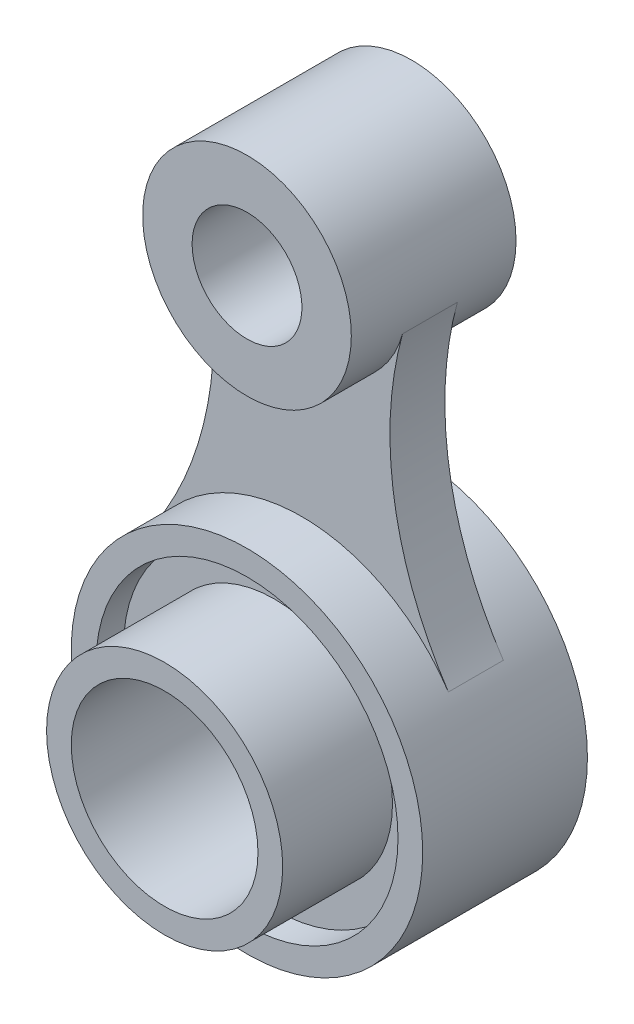
ISO-10303-21;
HEADER;
FILE_DESCRIPTION(('STEP AP214'),'2;1');
FILE_NAME('part.step','',(''),(''),'','','');
FILE_SCHEMA(('AUTOMOTIVE_DESIGN { 1 0 10303 214 1 1 1 1 }'));
ENDSEC;
DATA;
#1=APPLICATION_CONTEXT('core data for automotive mechanical design processes');
#2=APPLICATION_PROTOCOL_DEFINITION('international standard','automotive_design',2000,#1);
#3=PRODUCT_CONTEXT('',#1,'mechanical');
#4=PRODUCT('Part','Part','',(#3));
#5=PRODUCT_RELATED_PRODUCT_CATEGORY('part','',(#4));
#6=PRODUCT_DEFINITION_FORMATION('','',#4);
#7=PRODUCT_DEFINITION_CONTEXT('part definition',#1,'design');
#8=PRODUCT_DEFINITION('design','',#6,#7);
#9=PRODUCT_DEFINITION_SHAPE('','',#8);
#10=(LENGTH_UNIT() NAMED_UNIT(*) SI_UNIT(.MILLI.,.METRE.));
#11=(NAMED_UNIT(*) PLANE_ANGLE_UNIT() SI_UNIT($,.RADIAN.));
#12=(NAMED_UNIT(*) SI_UNIT($,.STERADIAN.) SOLID_ANGLE_UNIT());
#13=UNCERTAINTY_MEASURE_WITH_UNIT(LENGTH_MEASURE(1.E-05),#10,'distance_accuracy_value','');
#14=(GEOMETRIC_REPRESENTATION_CONTEXT(3) GLOBAL_UNCERTAINTY_ASSIGNED_CONTEXT((#13)) GLOBAL_UNIT_ASSIGNED_CONTEXT((#10,
#11,#12)) REPRESENTATION_CONTEXT('',''));
#15=CARTESIAN_POINT('',(0.,0.,0.));
#16=DIRECTION('',(0.,0.,1.));
#17=DIRECTION('',(1.,0.,0.));
#18=AXIS2_PLACEMENT_3D('',#15,#16,#17);
#19=CARTESIAN_POINT('',(0.,37.5,30.));
#20=DIRECTION('',(0.,0.,-1.));
#21=DIRECTION('',(-1.,0.,0.));
#22=AXIS2_PLACEMENT_3D('',#19,#20,#21);
#23=CYLINDRICAL_SURFACE('',#22,19.);
#24=CARTESIAN_POINT('',(0.,37.5,0.));
#25=DIRECTION('',(0.,0.,1.));
#26=DIRECTION('',(1.,0.,0.));
#27=AXIS2_PLACEMENT_3D('',#24,#25,#26);
#28=CIRCLE('',#27,19.);
#29=CARTESIAN_POINT('',(19.,37.5,0.));
#30=VERTEX_POINT('',#29);
#31=EDGE_CURVE('E37',#30,#30,#28,.T.);
#32=ORIENTED_EDGE('',*,*,#31,.T.);
#33=EDGE_LOOP('',(#32));
#34=FACE_BOUND('',#33,.T.);
#35=CARTESIAN_POINT('',(0.,37.5,30.));
#36=DIRECTION('',(0.,0.,1.));
#37=DIRECTION('',(1.,0.,0.));
#38=AXIS2_PLACEMENT_3D('',#35,#36,#37);
#39=CIRCLE('',#38,19.);
#40=CARTESIAN_POINT('',(19.,37.5,30.));
#41=VERTEX_POINT('',#40);
#42=EDGE_CURVE('E11',#41,#41,#39,.T.);
#43=ORIENTED_EDGE('',*,*,#42,.F.);
#44=EDGE_LOOP('',(#43));
#45=FACE_BOUND('',#44,.T.);
#46=CARTESIAN_POINT('',(0.,37.5,20.));
#47=DIRECTION('',(0.,0.,-1.));
#48=DIRECTION('',(1.,0.,0.));
#49=AXIS2_PLACEMENT_3D('',#46,#47,#48);
#50=CIRCLE('',#49,19.);
#51=CARTESIAN_POINT('',(18.3212439861572,32.4669076305221,20.));
#52=VERTEX_POINT('',#51);
#53=CARTESIAN_POINT('',(-18.3212439861572,32.4669076305221,20.));
#54=VERTEX_POINT('',#53);
#55=EDGE_CURVE('E57',#52,#54,#50,.T.);
#56=ORIENTED_EDGE('',*,*,#55,.F.);
#57=DIRECTION('',(0.,0.,-1.));
#58=VECTOR('',#57,1.);
#59=CARTESIAN_POINT('',(18.3212439861572,32.4669076305221,20.));
#60=LINE('',#59,#58);
#61=CARTESIAN_POINT('',(18.3212439861572,32.4669076305221,10.));
#62=VERTEX_POINT('',#61);
#63=EDGE_CURVE('E93',#52,#62,#60,.T.);
#64=ORIENTED_EDGE('',*,*,#63,.T.);
#65=CARTESIAN_POINT('',(0.,37.5,10.));
#66=DIRECTION('',(0.,0.,-1.));
#67=DIRECTION('',(1.,0.,0.));
#68=AXIS2_PLACEMENT_3D('',#65,#66,#67);
#69=CIRCLE('',#68,19.);
#70=CARTESIAN_POINT('',(-18.3212439861572,32.4669076305221,10.));
#71=VERTEX_POINT('',#70);
#72=EDGE_CURVE('E82',#62,#71,#69,.T.);
#73=ORIENTED_EDGE('',*,*,#72,.T.);
#74=DIRECTION('',(0.,0.,-1.));
#75=VECTOR('',#74,1.);
#76=CARTESIAN_POINT('',(-18.3212439861572,32.4669076305221,20.));
#77=LINE('',#76,#75);
#78=EDGE_CURVE('E103',#54,#71,#77,.T.);
#79=ORIENTED_EDGE('',*,*,#78,.F.);
#80=EDGE_LOOP('',(#56,#64,#73,#79));
#81=FACE_BOUND('',#80,.T.);
#82=ADVANCED_FACE('F34',(#34,#45,#81),#23,.T.);
#83=CARTESIAN_POINT('',(0.,37.5,30.));
#84=DIRECTION('',(0.,0.,1.));
#85=DIRECTION('',(1.,0.,0.));
#86=AXIS2_PLACEMENT_3D('',#83,#84,#85);
#87=PLANE('',#86);
#88=CARTESIAN_POINT('',(0.,37.5,30.));
#89=DIRECTION('',(0.,0.,1.));
#90=DIRECTION('',(1.,0.,0.));
#91=AXIS2_PLACEMENT_3D('',#88,#89,#90);
#92=CIRCLE('',#91,10.);
#93=CARTESIAN_POINT('',(-10.,37.5,30.));
#94=VERTEX_POINT('',#93);
#95=EDGE_CURVE('E290',#94,#94,#92,.F.);
#96=ORIENTED_EDGE('',*,*,#95,.T.);
#97=EDGE_LOOP('',(#96));
#98=FACE_BOUND('',#97,.T.);
#99=ORIENTED_EDGE('',*,*,#42,.T.);
#100=EDGE_LOOP('',(#99));
#101=FACE_BOUND('',#100,.T.);
#102=ADVANCED_FACE('F114',(#98,#101),#87,.T.);
#103=CARTESIAN_POINT('',(0.,37.5,0.));
#104=DIRECTION('',(0.,0.,1.));
#105=DIRECTION('',(1.,0.,0.));
#106=AXIS2_PLACEMENT_3D('',#103,#104,#105);
#107=PLANE('',#106);
#108=CARTESIAN_POINT('',(0.,37.5,0.));
#109=DIRECTION('',(0.,0.,1.));
#110=DIRECTION('',(1.,0.,0.));
#111=AXIS2_PLACEMENT_3D('',#108,#109,#110);
#112=CIRCLE('',#111,10.);
#113=CARTESIAN_POINT('',(-10.,37.5,0.));
#114=VERTEX_POINT('',#113);
#115=EDGE_CURVE('E295',#114,#114,#112,.T.);
#116=ORIENTED_EDGE('',*,*,#115,.T.);
#117=EDGE_LOOP('',(#116));
#118=FACE_BOUND('',#117,.T.);
#119=ORIENTED_EDGE('',*,*,#31,.F.);
#120=EDGE_LOOP('',(#119));
#121=FACE_BOUND('',#120,.T.);
#122=ADVANCED_FACE('F111',(#118,#121),#107,.F.);
#123=CARTESIAN_POINT('',(-80.034907939529,15.5133333333333,20.));
#124=DIRECTION('',(0.,0.,-1.));
#125=DIRECTION('',(-1.,0.,0.));
#126=AXIS2_PLACEMENT_3D('',#123,#124,#125);
#127=CYLINDRICAL_SURFACE('',#126,64.);
#128=CARTESIAN_POINT('',(-80.034907939529,15.5133333333333,10.));
#129=DIRECTION('',(0.,0.,-1.));
#130=DIRECTION('',(-1.,0.,0.));
#131=AXIS2_PLACEMENT_3D('',#128,#129,#130);
#132=CIRCLE('',#131,64.);
#133=CARTESIAN_POINT('',(-26.6783026465097,-19.8288888888889,10.));
#134=VERTEX_POINT('',#133);
#135=EDGE_CURVE('E48',#71,#134,#132,.T.);
#136=ORIENTED_EDGE('',*,*,#135,.T.);
#137=DIRECTION('',(0.,0.,-1.));
#138=VECTOR('',#137,1.);
#139=CARTESIAN_POINT('',(-26.6783026465097,-19.8288888888889,20.));
#140=LINE('',#139,#138);
#141=CARTESIAN_POINT('',(-26.6783026465097,-19.8288888888889,20.));
#142=VERTEX_POINT('',#141);
#143=EDGE_CURVE('E92',#142,#134,#140,.T.);
#144=ORIENTED_EDGE('',*,*,#143,.F.);
#145=CARTESIAN_POINT('',(-80.034907939529,15.5133333333333,20.));
#146=DIRECTION('',(0.,0.,-1.));
#147=DIRECTION('',(-1.,0.,0.));
#148=AXIS2_PLACEMENT_3D('',#145,#146,#147);
#149=CIRCLE('',#148,64.);
#150=EDGE_CURVE('E75',#54,#142,#149,.T.);
#151=ORIENTED_EDGE('',*,*,#150,.F.);
#152=ORIENTED_EDGE('',*,*,#78,.T.);
#153=EDGE_LOOP('',(#136,#144,#151,#152));
#154=FACE_BOUND('',#153,.T.);
#155=ADVANCED_FACE('F113',(#154),#127,.F.);
#156=CARTESIAN_POINT('',(80.034907939529,15.5133333333333,20.));
#157=DIRECTION('',(0.,0.,-1.));
#158=DIRECTION('',(-1.,0.,0.));
#159=AXIS2_PLACEMENT_3D('',#156,#157,#158);
#160=CYLINDRICAL_SURFACE('',#159,64.);
#161=CARTESIAN_POINT('',(80.034907939529,15.5133333333333,10.));
#162=DIRECTION('',(0.,0.,-1.));
#163=DIRECTION('',(1.,0.,0.));
#164=AXIS2_PLACEMENT_3D('',#161,#162,#163);
#165=CIRCLE('',#164,64.);
#166=CARTESIAN_POINT('',(26.6783026465097,-19.8288888888889,10.));
#167=VERTEX_POINT('',#166);
#168=EDGE_CURVE('E72',#167,#62,#165,.T.);
#169=ORIENTED_EDGE('',*,*,#168,.T.);
#170=ORIENTED_EDGE('',*,*,#63,.F.);
#171=CARTESIAN_POINT('',(80.034907939529,15.5133333333333,20.));
#172=DIRECTION('',(0.,0.,-1.));
#173=DIRECTION('',(1.,0.,0.));
#174=AXIS2_PLACEMENT_3D('',#171,#172,#173);
#175=CIRCLE('',#174,64.);
#176=CARTESIAN_POINT('',(26.6783026465097,-19.8288888888889,20.));
#177=VERTEX_POINT('',#176);
#178=EDGE_CURVE('E89',#177,#52,#175,.T.);
#179=ORIENTED_EDGE('',*,*,#178,.F.);
#180=DIRECTION('',(0.,0.,-1.));
#181=VECTOR('',#180,1.);
#182=CARTESIAN_POINT('',(26.6783026465097,-19.8288888888889,20.));
#183=LINE('',#182,#181);
#184=EDGE_CURVE('E87',#177,#167,#183,.T.);
#185=ORIENTED_EDGE('',*,*,#184,.T.);
#186=EDGE_LOOP('',(#169,#170,#179,#185));
#187=FACE_BOUND('',#186,.T.);
#188=ADVANCED_FACE('F88',(#187),#160,.F.);
#189=CARTESIAN_POINT('',(-40.0174539697645,-10.9933333333333,20.));
#190=DIRECTION('',(0.,0.,-1.));
#191=DIRECTION('',(-1.,0.,0.));
#192=AXIS2_PLACEMENT_3D('',#189,#190,#191);
#193=PLANE('',#192);
#194=ORIENTED_EDGE('',*,*,#150,.T.);
#195=CARTESIAN_POINT('',(0.,-37.5,20.));
#196=DIRECTION('',(0.,0.,-1.));
#197=DIRECTION('',(1.,0.,0.));
#198=AXIS2_PLACEMENT_3D('',#195,#196,#197);
#199=CIRCLE('',#198,32.);
#200=EDGE_CURVE('E280',#142,#177,#199,.T.);
#201=ORIENTED_EDGE('',*,*,#200,.T.);
#202=ORIENTED_EDGE('',*,*,#178,.T.);
#203=ORIENTED_EDGE('',*,*,#55,.T.);
#204=EDGE_LOOP('',(#194,#201,#202,#203));
#205=FACE_BOUND('',#204,.T.);
#206=ADVANCED_FACE('F209',(#205),#193,.F.);
#207=CARTESIAN_POINT('',(-40.0174539697645,-10.9933333333333,10.));
#208=DIRECTION('',(0.,0.,-1.));
#209=DIRECTION('',(-1.,0.,0.));
#210=AXIS2_PLACEMENT_3D('',#207,#208,#209);
#211=PLANE('',#210);
#212=ORIENTED_EDGE('',*,*,#135,.F.);
#213=ORIENTED_EDGE('',*,*,#72,.F.);
#214=ORIENTED_EDGE('',*,*,#168,.F.);
#215=CARTESIAN_POINT('',(0.,-37.5,10.));
#216=DIRECTION('',(0.,0.,-1.));
#217=DIRECTION('',(1.,0.,0.));
#218=AXIS2_PLACEMENT_3D('',#215,#216,#217);
#219=CIRCLE('',#218,32.);
#220=EDGE_CURVE('E80',#134,#167,#219,.T.);
#221=ORIENTED_EDGE('',*,*,#220,.F.);
#222=EDGE_LOOP('',(#212,#213,#214,#221));
#223=FACE_BOUND('',#222,.T.);
#224=ADVANCED_FACE('F78',(#223),#211,.T.);
#225=CARTESIAN_POINT('',(0.,-37.5,30.));
#226=DIRECTION('',(0.,0.,-1.));
#227=DIRECTION('',(-1.,0.,0.));
#228=AXIS2_PLACEMENT_3D('',#225,#226,#227);
#229=CYLINDRICAL_SURFACE('',#228,32.);
#230=CARTESIAN_POINT('',(0.,-37.5,30.));
#231=DIRECTION('',(0.,0.,1.));
#232=DIRECTION('',(1.,0.,0.));
#233=AXIS2_PLACEMENT_3D('',#230,#231,#232);
#234=CIRCLE('',#233,32.);
#235=CARTESIAN_POINT('',(32.,-37.5,30.));
#236=VERTEX_POINT('',#235);
#237=EDGE_CURVE('E98',#236,#236,#234,.T.);
#238=ORIENTED_EDGE('',*,*,#237,.F.);
#239=EDGE_LOOP('',(#238));
#240=FACE_BOUND('',#239,.T.);
#241=CARTESIAN_POINT('',(0.,-37.5,0.));
#242=DIRECTION('',(0.,0.,1.));
#243=DIRECTION('',(1.,0.,0.));
#244=AXIS2_PLACEMENT_3D('',#241,#242,#243);
#245=CIRCLE('',#244,32.);
#246=CARTESIAN_POINT('',(32.,-37.5,0.));
#247=VERTEX_POINT('',#246);
#248=EDGE_CURVE('E269',#247,#247,#245,.T.);
#249=ORIENTED_EDGE('',*,*,#248,.T.);
#250=EDGE_LOOP('',(#249));
#251=FACE_BOUND('',#250,.T.);
#252=ORIENTED_EDGE('',*,*,#184,.F.);
#253=ORIENTED_EDGE('',*,*,#200,.F.);
#254=ORIENTED_EDGE('',*,*,#143,.T.);
#255=ORIENTED_EDGE('',*,*,#220,.T.);
#256=EDGE_LOOP('',(#252,#253,#254,#255));
#257=FACE_BOUND('',#256,.T.);
#258=ADVANCED_FACE('F96',(#240,#251,#257),#229,.T.);
#259=CARTESIAN_POINT('',(0.,-37.5,30.));
#260=DIRECTION('',(0.,0.,1.));
#261=DIRECTION('',(1.,0.,0.));
#262=AXIS2_PLACEMENT_3D('',#259,#260,#261);
#263=PLANE('',#262);
#264=CARTESIAN_POINT('',(0.,-37.5,30.));
#265=DIRECTION('',(0.,0.,1.));
#266=DIRECTION('',(1.,0.,0.));
#267=AXIS2_PLACEMENT_3D('',#264,#265,#266);
#268=CIRCLE('',#267,27.5);
#269=CARTESIAN_POINT('',(27.5,-37.5,30.));
#270=VERTEX_POINT('',#269);
#271=EDGE_CURVE('E271',#270,#270,#268,.T.);
#272=ORIENTED_EDGE('',*,*,#271,.F.);
#273=EDGE_LOOP('',(#272));
#274=FACE_BOUND('',#273,.T.);
#275=ORIENTED_EDGE('',*,*,#237,.T.);
#276=EDGE_LOOP('',(#275));
#277=FACE_BOUND('',#276,.T.);
#278=ADVANCED_FACE('F154',(#274,#277),#263,.T.);
#279=CARTESIAN_POINT('',(0.,-37.5,0.));
#280=DIRECTION('',(0.,0.,1.));
#281=DIRECTION('',(1.,0.,0.));
#282=AXIS2_PLACEMENT_3D('',#279,#280,#281);
#283=PLANE('',#282);
#284=CARTESIAN_POINT('',(0.,-37.5,0.));
#285=DIRECTION('',(0.,0.,1.));
#286=DIRECTION('',(1.,0.,0.));
#287=AXIS2_PLACEMENT_3D('',#284,#285,#286);
#288=CIRCLE('',#287,17.);
#289=CARTESIAN_POINT('',(-17.,-37.5,0.));
#290=VERTEX_POINT('',#289);
#291=EDGE_CURVE('E296',#290,#290,#288,.T.);
#292=ORIENTED_EDGE('',*,*,#291,.T.);
#293=EDGE_LOOP('',(#292));
#294=FACE_BOUND('',#293,.T.);
#295=ORIENTED_EDGE('',*,*,#248,.F.);
#296=EDGE_LOOP('',(#295));
#297=FACE_BOUND('',#296,.T.);
#298=ADVANCED_FACE('F148',(#294,#297),#283,.F.);
#299=CARTESIAN_POINT('',(0.,-37.5,30.));
#300=DIRECTION('',(0.,0.,-1.));
#301=DIRECTION('',(-1.,0.,0.));
#302=AXIS2_PLACEMENT_3D('',#299,#300,#301);
#303=CYLINDRICAL_SURFACE('',#302,27.5);
#304=ORIENTED_EDGE('',*,*,#271,.T.);
#305=EDGE_LOOP('',(#304));
#306=FACE_BOUND('',#305,.T.);
#307=CARTESIAN_POINT('',(0.,-37.5,25.));
#308=DIRECTION('',(0.,0.,1.));
#309=DIRECTION('',(1.,0.,0.));
#310=AXIS2_PLACEMENT_3D('',#307,#308,#309);
#311=CIRCLE('',#310,27.5);
#312=CARTESIAN_POINT('',(27.5,-37.5,25.));
#313=VERTEX_POINT('',#312);
#314=EDGE_CURVE('E275',#313,#313,#311,.T.);
#315=ORIENTED_EDGE('',*,*,#314,.F.);
#316=EDGE_LOOP('',(#315));
#317=FACE_BOUND('',#316,.T.);
#318=ADVANCED_FACE('F153',(#306,#317),#303,.F.);
#319=CARTESIAN_POINT('',(0.,-37.5,25.));
#320=DIRECTION('',(0.,0.,1.));
#321=DIRECTION('',(1.,0.,0.));
#322=AXIS2_PLACEMENT_3D('',#319,#320,#321);
#323=PLANE('',#322);
#324=CARTESIAN_POINT('',(0.,-37.5,25.));
#325=DIRECTION('',(0.,0.,1.));
#326=DIRECTION('',(1.,0.,0.));
#327=AXIS2_PLACEMENT_3D('',#324,#325,#326);
#328=CIRCLE('',#327,21.5);
#329=CARTESIAN_POINT('',(21.5,-37.5,25.));
#330=VERTEX_POINT('',#329);
#331=EDGE_CURVE('E287',#330,#330,#328,.T.);
#332=ORIENTED_EDGE('',*,*,#331,.F.);
#333=EDGE_LOOP('',(#332));
#334=FACE_BOUND('',#333,.T.);
#335=ORIENTED_EDGE('',*,*,#314,.T.);
#336=EDGE_LOOP('',(#335));
#337=FACE_BOUND('',#336,.T.);
#338=ADVANCED_FACE('F197',(#334,#337),#323,.T.);
#339=CARTESIAN_POINT('',(0.,-37.5,45.));
#340=DIRECTION('',(0.,0.,-1.));
#341=DIRECTION('',(-1.,0.,0.));
#342=AXIS2_PLACEMENT_3D('',#339,#340,#341);
#343=CYLINDRICAL_SURFACE('',#342,21.5);
#344=CARTESIAN_POINT('',(0.,-37.5,45.));
#345=DIRECTION('',(0.,0.,1.));
#346=DIRECTION('',(1.,0.,0.));
#347=AXIS2_PLACEMENT_3D('',#344,#345,#346);
#348=CIRCLE('',#347,21.5);
#349=CARTESIAN_POINT('',(21.5,-37.5,45.));
#350=VERTEX_POINT('',#349);
#351=EDGE_CURVE('E285',#350,#350,#348,.T.);
#352=ORIENTED_EDGE('',*,*,#351,.F.);
#353=EDGE_LOOP('',(#352));
#354=FACE_BOUND('',#353,.T.);
#355=ORIENTED_EDGE('',*,*,#331,.T.);
#356=EDGE_LOOP('',(#355));
#357=FACE_BOUND('',#356,.T.);
#358=ADVANCED_FACE('F139',(#354,#357),#343,.T.);
#359=CARTESIAN_POINT('',(0.,-37.5,45.));
#360=DIRECTION('',(0.,0.,1.));
#361=DIRECTION('',(1.,0.,0.));
#362=AXIS2_PLACEMENT_3D('',#359,#360,#361);
#363=PLANE('',#362);
#364=CARTESIAN_POINT('',(0.,-37.5,45.));
#365=DIRECTION('',(0.,0.,1.));
#366=DIRECTION('',(1.,0.,0.));
#367=AXIS2_PLACEMENT_3D('',#364,#365,#366);
#368=CIRCLE('',#367,17.);
#369=CARTESIAN_POINT('',(-17.,-37.5,45.));
#370=VERTEX_POINT('',#369);
#371=EDGE_CURVE('E299',#370,#370,#368,.T.);
#372=ORIENTED_EDGE('',*,*,#371,.F.);
#373=EDGE_LOOP('',(#372));
#374=FACE_BOUND('',#373,.T.);
#375=ORIENTED_EDGE('',*,*,#351,.T.);
#376=EDGE_LOOP('',(#375));
#377=FACE_BOUND('',#376,.T.);
#378=ADVANCED_FACE('F164',(#374,#377),#363,.T.);
#379=CARTESIAN_POINT('',(0.,-37.5,45.));
#380=DIRECTION('',(0.,0.,-1.));
#381=DIRECTION('',(-1.,0.,0.));
#382=AXIS2_PLACEMENT_3D('',#379,#380,#381);
#383=CYLINDRICAL_SURFACE('',#382,17.);
#384=CARTESIAN_POINT('',(-17.,-37.5,45.));
#385=CARTESIAN_POINT('',(-17.,-37.5,44.53125));
#386=CARTESIAN_POINT('',(-17.,-37.5,44.0625));
#387=CARTESIAN_POINT('',(-17.,-37.5,43.125));
#388=CARTESIAN_POINT('',(-17.,-37.5,42.65625));
#389=CARTESIAN_POINT('',(-17.,-37.5,41.71875));
#390=CARTESIAN_POINT('',(-17.,-37.5,41.25));
#391=CARTESIAN_POINT('',(-17.,-37.5,40.3125));
#392=CARTESIAN_POINT('',(-17.,-37.5,39.84375));
#393=CARTESIAN_POINT('',(-17.,-37.5,38.90625));
#394=CARTESIAN_POINT('',(-17.,-37.5,38.4375));
#395=CARTESIAN_POINT('',(-17.,-37.5,37.5));
#396=CARTESIAN_POINT('',(-17.,-37.5,37.03125));
#397=CARTESIAN_POINT('',(-17.,-37.5,36.09375));
#398=CARTESIAN_POINT('',(-17.,-37.5,35.625));
#399=CARTESIAN_POINT('',(-17.,-37.5,34.6875));
#400=CARTESIAN_POINT('',(-17.,-37.5,34.21875));
#401=CARTESIAN_POINT('',(-17.,-37.5,33.28125));
#402=CARTESIAN_POINT('',(-17.,-37.5,32.8125));
#403=CARTESIAN_POINT('',(-17.,-37.5,31.875));
#404=CARTESIAN_POINT('',(-17.,-37.5,31.40625));
#405=CARTESIAN_POINT('',(-17.,-37.5,30.46875));
#406=CARTESIAN_POINT('',(-17.,-37.5,30.));
#407=CARTESIAN_POINT('',(-17.,-37.5,29.0625));
#408=CARTESIAN_POINT('',(-17.,-37.5,28.59375));
#409=CARTESIAN_POINT('',(-17.,-37.5,27.65625));
#410=CARTESIAN_POINT('',(-17.,-37.5,27.1875));
#411=CARTESIAN_POINT('',(-17.,-37.5,26.25));
#412=CARTESIAN_POINT('',(-17.,-37.5,25.78125));
#413=CARTESIAN_POINT('',(-17.,-37.5,24.84375));
#414=CARTESIAN_POINT('',(-17.,-37.5,24.375));
#415=CARTESIAN_POINT('',(-17.,-37.5,23.4375));
#416=CARTESIAN_POINT('',(-17.,-37.5,22.96875));
#417=CARTESIAN_POINT('',(-17.,-37.5,22.03125));
#418=CARTESIAN_POINT('',(-17.,-37.5,21.5625));
#419=CARTESIAN_POINT('',(-17.,-37.5,20.625));
#420=CARTESIAN_POINT('',(-17.,-37.5,20.15625));
#421=CARTESIAN_POINT('',(-17.,-37.5,19.21875));
#422=CARTESIAN_POINT('',(-17.,-37.5,18.75));
#423=CARTESIAN_POINT('',(-17.,-37.5,17.8125));
#424=CARTESIAN_POINT('',(-17.,-37.5,17.34375));
#425=CARTESIAN_POINT('',(-17.,-37.5,16.40625));
#426=CARTESIAN_POINT('',(-17.,-37.5,15.9375));
#427=CARTESIAN_POINT('',(-17.,-37.5,15.));
#428=CARTESIAN_POINT('',(-17.,-37.5,14.53125));
#429=CARTESIAN_POINT('',(-17.,-37.5,13.59375));
#430=CARTESIAN_POINT('',(-17.,-37.5,13.125));
#431=CARTESIAN_POINT('',(-17.,-37.5,12.1875));
#432=CARTESIAN_POINT('',(-17.,-37.5,11.71875));
#433=CARTESIAN_POINT('',(-17.,-37.5,10.78125));
#434=CARTESIAN_POINT('',(-17.,-37.5,10.3125));
#435=CARTESIAN_POINT('',(-17.,-37.5,9.37499999999999));
#436=CARTESIAN_POINT('',(-17.,-37.5,8.90624999999999));
#437=CARTESIAN_POINT('',(-17.,-37.5,7.96874999999999));
#438=CARTESIAN_POINT('',(-17.,-37.5,7.5));
#439=CARTESIAN_POINT('',(-17.,-37.5,6.56249999999999));
#440=CARTESIAN_POINT('',(-17.,-37.5,6.09374999999999));
#441=CARTESIAN_POINT('',(-17.,-37.5,5.15624999999999));
#442=CARTESIAN_POINT('',(-17.,-37.5,4.68749999999999));
#443=CARTESIAN_POINT('',(-17.,-37.5,3.74999999999999));
#444=CARTESIAN_POINT('',(-17.,-37.5,3.28124999999999));
#445=CARTESIAN_POINT('',(-17.,-37.5,2.34374999999999));
#446=CARTESIAN_POINT('',(-17.,-37.5,1.87499999999999));
#447=CARTESIAN_POINT('',(-17.,-37.5,0.937499999999992));
#448=CARTESIAN_POINT('',(-17.,-37.5,0.468749999999993));
#449=CARTESIAN_POINT('',(-17.,-37.5,0.));
#450=B_SPLINE_CURVE_WITH_KNOTS('',3,(#384,#385,#386,#387,#388,#389,#390,#391,#392,#393,#394,
#395,#396,#397,#398,#399,#400,#401,#402,#403,#404,#405,#406,#407,#408,#409,#410,#411,#412,#413,
#414,#415,#416,#417,#418,#419,#420,#421,#422,#423,#424,#425,#426,#427,#428,#429,#430,#431,#432,
#433,#434,#435,#436,#437,#438,#439,#440,#441,#442,#443,#444,#445,#446,#447,#448,#449),
.UNSPECIFIED.,.F.,.F.,(4,2,2,2,2,2,2,2,2,2,2,2,2,2,2,2,2,2,2,2,2,2,2,2,2,2,2,2,2,2,2,2,4),(0.,
1.40625,2.8125,4.21874999999999,5.625,7.03125,8.43749999999999,9.84375,11.25,12.65625,14.0625,
15.46875,16.875,18.28125,19.6875,21.09375,22.5,23.90625,25.3125,26.71875,28.125,29.53125,
30.9375,32.34375,33.75,35.15625,36.5625,37.96875,39.375,40.78125,42.1875,43.59375,45.),.UNSPECIFIED.);
#451=EDGE_CURVE('BSEAM169',#370,#290,#450,.T.);
#452=ORIENTED_EDGE('',*,*,#371,.T.);
#453=ORIENTED_EDGE('',*,*,#291,.F.);
#454=ORIENTED_EDGE('',*,*,#451,.T.);
#455=ORIENTED_EDGE('',*,*,#451,.F.);
#456=EDGE_LOOP('',(#452,#454,#453,#455));
#457=FACE_BOUND('',#456,.T.);
#458=ADVANCED_FACE('F169',(#457),#383,.F.);
#459=CARTESIAN_POINT('',(0.,37.5,45.));
#460=DIRECTION('',(0.,0.,-1.));
#461=DIRECTION('',(-1.,0.,0.));
#462=AXIS2_PLACEMENT_3D('',#459,#460,#461);
#463=CYLINDRICAL_SURFACE('',#462,10.);
#464=CARTESIAN_POINT('',(-10.,37.5,30.));
#465=CARTESIAN_POINT('',(-10.,37.5,29.6875));
#466=CARTESIAN_POINT('',(-10.,37.5,29.375));
#467=CARTESIAN_POINT('',(-10.,37.5,28.75));
#468=CARTESIAN_POINT('',(-10.,37.5,28.4375));
#469=CARTESIAN_POINT('',(-10.,37.5,27.8125));
#470=CARTESIAN_POINT('',(-10.,37.5,27.5));
#471=CARTESIAN_POINT('',(-10.,37.5,26.875));
#472=CARTESIAN_POINT('',(-10.,37.5,26.5625));
#473=CARTESIAN_POINT('',(-10.,37.5,25.9375));
#474=CARTESIAN_POINT('',(-10.,37.5,25.625));
#475=CARTESIAN_POINT('',(-10.,37.5,25.));
#476=CARTESIAN_POINT('',(-10.,37.5,24.6875));
#477=CARTESIAN_POINT('',(-10.,37.5,24.0625));
#478=CARTESIAN_POINT('',(-10.,37.5,23.75));
#479=CARTESIAN_POINT('',(-10.,37.5,23.125));
#480=CARTESIAN_POINT('',(-10.,37.5,22.8125));
#481=CARTESIAN_POINT('',(-10.,37.5,22.1875));
#482=CARTESIAN_POINT('',(-10.,37.5,21.875));
#483=CARTESIAN_POINT('',(-10.,37.5,21.25));
#484=CARTESIAN_POINT('',(-10.,37.5,20.9375));
#485=CARTESIAN_POINT('',(-10.,37.5,20.3125));
#486=CARTESIAN_POINT('',(-10.,37.5,20.));
#487=CARTESIAN_POINT('',(-10.,37.5,19.375));
#488=CARTESIAN_POINT('',(-10.,37.5,19.0625));
#489=CARTESIAN_POINT('',(-10.,37.5,18.4375));
#490=CARTESIAN_POINT('',(-10.,37.5,18.125));
#491=CARTESIAN_POINT('',(-10.,37.5,17.5));
#492=CARTESIAN_POINT('',(-10.,37.5,17.1875));
#493=CARTESIAN_POINT('',(-10.,37.5,16.5625));
#494=CARTESIAN_POINT('',(-10.,37.5,16.25));
#495=CARTESIAN_POINT('',(-10.,37.5,15.625));
#496=CARTESIAN_POINT('',(-10.,37.5,15.3125));
#497=CARTESIAN_POINT('',(-10.,37.5,14.6875));
#498=CARTESIAN_POINT('',(-10.,37.5,14.375));
#499=CARTESIAN_POINT('',(-10.,37.5,13.75));
#500=CARTESIAN_POINT('',(-10.,37.5,13.4375));
#501=CARTESIAN_POINT('',(-10.,37.5,12.8125));
#502=CARTESIAN_POINT('',(-10.,37.5,12.5));
#503=CARTESIAN_POINT('',(-10.,37.5,11.875));
#504=CARTESIAN_POINT('',(-10.,37.5,11.5625));
#505=CARTESIAN_POINT('',(-10.,37.5,10.9375));
#506=CARTESIAN_POINT('',(-10.,37.5,10.625));
#507=CARTESIAN_POINT('',(-10.,37.5,9.99999999999999));
#508=CARTESIAN_POINT('',(-10.,37.5,9.68749999999999));
#509=CARTESIAN_POINT('',(-10.,37.5,9.06249999999999));
#510=CARTESIAN_POINT('',(-10.,37.5,8.74999999999999));
#511=CARTESIAN_POINT('',(-10.,37.5,8.12499999999999));
#512=CARTESIAN_POINT('',(-10.,37.5,7.8125));
#513=CARTESIAN_POINT('',(-10.,37.5,7.1875));
#514=CARTESIAN_POINT('',(-10.,37.5,6.87499999999999));
#515=CARTESIAN_POINT('',(-10.,37.5,6.24999999999999));
#516=CARTESIAN_POINT('',(-10.,37.5,5.9375));
#517=CARTESIAN_POINT('',(-10.,37.5,5.3125));
#518=CARTESIAN_POINT('',(-10.,37.5,4.99999999999999));
#519=CARTESIAN_POINT('',(-10.,37.5,4.37499999999999));
#520=CARTESIAN_POINT('',(-10.,37.5,4.06249999999999));
#521=CARTESIAN_POINT('',(-10.,37.5,3.4375));
#522=CARTESIAN_POINT('',(-10.,37.5,3.125));
#523=CARTESIAN_POINT('',(-10.,37.5,2.5));
#524=CARTESIAN_POINT('',(-10.,37.5,2.1875));
#525=CARTESIAN_POINT('',(-10.,37.5,1.56249999999999));
#526=CARTESIAN_POINT('',(-10.,37.5,1.24999999999999));
#527=CARTESIAN_POINT('',(-10.,37.5,0.624999999999994));
#528=CARTESIAN_POINT('',(-10.,37.5,0.312499999999993));
#529=CARTESIAN_POINT('',(-10.,37.5,0.));
#530=B_SPLINE_CURVE_WITH_KNOTS('',3,(#464,#465,#466,#467,#468,#469,#470,#471,#472,#473,#474,
#475,#476,#477,#478,#479,#480,#481,#482,#483,#484,#485,#486,#487,#488,#489,#490,#491,#492,#493,
#494,#495,#496,#497,#498,#499,#500,#501,#502,#503,#504,#505,#506,#507,#508,#509,#510,#511,#512,
#513,#514,#515,#516,#517,#518,#519,#520,#521,#522,#523,#524,#525,#526,#527,#528,#529),
.UNSPECIFIED.,.F.,.F.,(4,2,2,2,2,2,2,2,2,2,2,2,2,2,2,2,2,2,2,2,2,2,2,2,2,2,2,2,2,2,2,2,4),(0.,
0.937500000000001,1.875,2.8125,3.75,4.6875,5.625,6.5625,7.5,8.4375,9.37500000000001,10.3125,
11.25,12.1875,13.125,14.0625,15.,15.9375,16.875,17.8125,18.75,19.6875,20.625,21.5625,22.5,
23.4375,24.375,25.3125,26.25,27.1875,28.125,29.0625,30.),.UNSPECIFIED.);
#531=EDGE_CURVE('BSEAM179',#94,#114,#530,.T.);
#532=ORIENTED_EDGE('',*,*,#95,.F.);
#533=ORIENTED_EDGE('',*,*,#115,.F.);
#534=ORIENTED_EDGE('',*,*,#531,.T.);
#535=ORIENTED_EDGE('',*,*,#531,.F.);
#536=EDGE_LOOP('',(#532,#534,#533,#535));
#537=FACE_BOUND('',#536,.T.);
#538=ADVANCED_FACE('F179',(#537),#463,.F.);
#539=CLOSED_SHELL('',(#82,#102,#122,#155,#188,#206,#224,#258,#278,#298,#318,#338,#358,#378,#458,#538));
#540=MANIFOLD_SOLID_BREP('B2',#539);
#541=ADVANCED_BREP_SHAPE_REPRESENTATION('',(#18,#540),#14);
#542=SHAPE_DEFINITION_REPRESENTATION(#9,#541);
ENDSEC;
END-ISO-10303-21;
